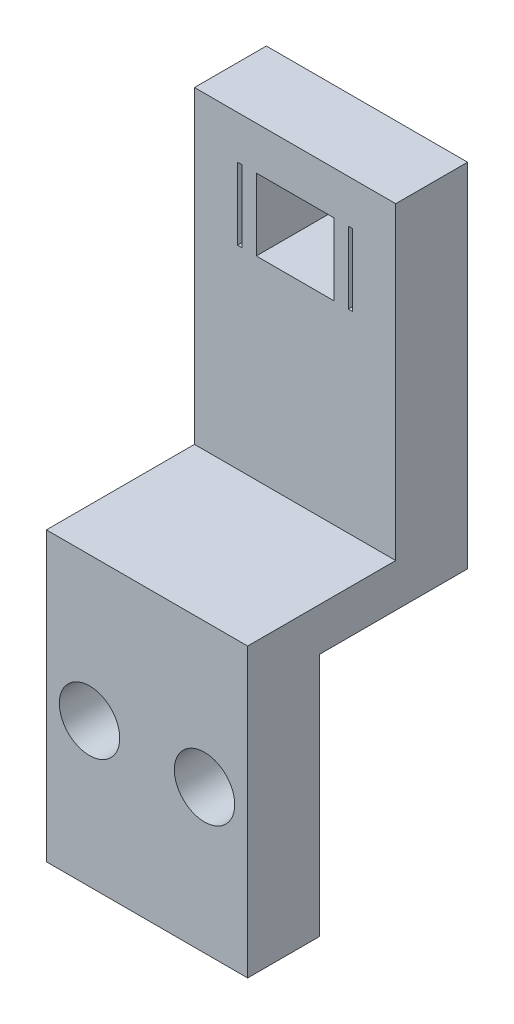
ISO-10303-21;
HEADER;
FILE_DESCRIPTION(('STEP AP214'),'2;1');
FILE_NAME('part.step','',(''),(''),'','','');
FILE_SCHEMA(('AUTOMOTIVE_DESIGN { 1 0 10303 214 1 1 1 1 }'));
ENDSEC;
DATA;
#1=APPLICATION_CONTEXT('core data for automotive mechanical design processes');
#2=APPLICATION_PROTOCOL_DEFINITION('international standard','automotive_design',2000,#1);
#3=PRODUCT_CONTEXT('',#1,'mechanical');
#4=PRODUCT('Part','Part','',(#3));
#5=PRODUCT_RELATED_PRODUCT_CATEGORY('part','',(#4));
#6=PRODUCT_DEFINITION_FORMATION('','',#4);
#7=PRODUCT_DEFINITION_CONTEXT('part definition',#1,'design');
#8=PRODUCT_DEFINITION('design','',#6,#7);
#9=PRODUCT_DEFINITION_SHAPE('','',#8);
#10=(LENGTH_UNIT() NAMED_UNIT(*) SI_UNIT(.MILLI.,.METRE.));
#11=(NAMED_UNIT(*) PLANE_ANGLE_UNIT() SI_UNIT($,.RADIAN.));
#12=(NAMED_UNIT(*) SI_UNIT($,.STERADIAN.) SOLID_ANGLE_UNIT());
#13=UNCERTAINTY_MEASURE_WITH_UNIT(LENGTH_MEASURE(1.E-05),#10,'distance_accuracy_value','');
#14=(GEOMETRIC_REPRESENTATION_CONTEXT(3) GLOBAL_UNCERTAINTY_ASSIGNED_CONTEXT((#13)) GLOBAL_UNIT_ASSIGNED_CONTEXT((#10,
#11,#12)) REPRESENTATION_CONTEXT('',''));
#15=CARTESIAN_POINT('',(0.,0.,0.));
#16=DIRECTION('',(0.,0.,1.));
#17=DIRECTION('',(1.,0.,0.));
#18=AXIS2_PLACEMENT_3D('',#15,#16,#17);
#19=CARTESIAN_POINT('',(0.,38.5,15.3));
#20=DIRECTION('',(0.,1.,0.));
#21=DIRECTION('',(-1.,0.,0.));
#22=AXIS2_PLACEMENT_3D('',#19,#20,#21);
#23=PLANE('',#22);
#24=DIRECTION('',(0.,0.,-1.));
#25=VECTOR('',#24,1.);
#26=CARTESIAN_POINT('',(3.3,38.5,15.3));
#27=LINE('',#26,#25);
#28=CARTESIAN_POINT('',(3.3,38.5,5.));
#29=VERTEX_POINT('',#28);
#30=CARTESIAN_POINT('',(3.3,38.5,0.));
#31=VERTEX_POINT('',#30);
#32=EDGE_CURVE('E215',#29,#31,#27,.T.);
#33=ORIENTED_EDGE('',*,*,#32,.F.);
#34=DIRECTION('',(-1.,0.,0.));
#35=VECTOR('',#34,1.);
#36=CARTESIAN_POINT('',(0.,38.5,5.));
#37=LINE('',#36,#35);
#38=CARTESIAN_POINT('',(3.,38.5,5.));
#39=VERTEX_POINT('',#38);
#40=EDGE_CURVE('E421',#29,#39,#37,.T.);
#41=ORIENTED_EDGE('',*,*,#40,.T.);
#42=DIRECTION('',(0.,0.,-1.));
#43=VECTOR('',#42,1.);
#44=CARTESIAN_POINT('',(3.,38.5,15.3));
#45=LINE('',#44,#43);
#46=CARTESIAN_POINT('',(3.,38.5,0.));
#47=VERTEX_POINT('',#46);
#48=EDGE_CURVE('E221',#39,#47,#45,.T.);
#49=ORIENTED_EDGE('',*,*,#48,.T.);
#50=DIRECTION('',(1.,0.,0.));
#51=VECTOR('',#50,1.);
#52=CARTESIAN_POINT('',(0.,38.5,0.));
#53=LINE('',#52,#51);
#54=EDGE_CURVE('E273',#47,#31,#53,.T.);
#55=ORIENTED_EDGE('',*,*,#54,.T.);
#56=EDGE_LOOP('',(#33,#41,#49,#55));
#57=FACE_BOUND('',#56,.T.);
#58=ADVANCED_FACE('F43',(#57),#23,.F.);
#59=CARTESIAN_POINT('',(3.3,0.,15.3));
#60=DIRECTION('',(1.,0.,0.));
#61=DIRECTION('',(0.,1.,0.));
#62=AXIS2_PLACEMENT_3D('',#59,#60,#61);
#63=PLANE('',#62);
#64=DIRECTION('',(0.,0.,-1.));
#65=VECTOR('',#64,1.);
#66=CARTESIAN_POINT('',(3.3,33.5,15.3));
#67=LINE('',#66,#65);
#68=CARTESIAN_POINT('',(3.3,33.5,5.));
#69=VERTEX_POINT('',#68);
#70=CARTESIAN_POINT('',(3.3,33.5,0.));
#71=VERTEX_POINT('',#70);
#72=EDGE_CURVE('E306',#69,#71,#67,.T.);
#73=ORIENTED_EDGE('',*,*,#72,.F.);
#74=DIRECTION('',(0.,1.,0.));
#75=VECTOR('',#74,1.);
#76=CARTESIAN_POINT('',(3.3,0.,5.00000000000001));
#77=LINE('',#76,#75);
#78=EDGE_CURVE('E317',#69,#29,#77,.T.);
#79=ORIENTED_EDGE('',*,*,#78,.T.);
#80=ORIENTED_EDGE('',*,*,#32,.T.);
#81=DIRECTION('',(0.,-1.,0.));
#82=VECTOR('',#81,1.);
#83=CARTESIAN_POINT('',(3.3,0.,0.));
#84=LINE('',#83,#82);
#85=EDGE_CURVE('E297',#31,#71,#84,.T.);
#86=ORIENTED_EDGE('',*,*,#85,.T.);
#87=EDGE_LOOP('',(#73,#79,#80,#86));
#88=FACE_BOUND('',#87,.T.);
#89=ADVANCED_FACE('F315',(#88),#63,.F.);
#90=CARTESIAN_POINT('',(0.,33.5,15.3));
#91=DIRECTION('',(0.,1.,0.));
#92=DIRECTION('',(0.,0.,1.));
#93=AXIS2_PLACEMENT_3D('',#90,#91,#92);
#94=PLANE('',#93);
#95=DIRECTION('',(-1.,0.,0.));
#96=VECTOR('',#95,1.);
#97=CARTESIAN_POINT('',(0.,33.5,5.));
#98=LINE('',#97,#96);
#99=CARTESIAN_POINT('',(3.,33.5,5.));
#100=VERTEX_POINT('',#99);
#101=EDGE_CURVE('E255',#69,#100,#98,.T.);
#102=ORIENTED_EDGE('',*,*,#101,.F.);
#103=ORIENTED_EDGE('',*,*,#72,.T.);
#104=DIRECTION('',(1.,0.,0.));
#105=VECTOR('',#104,1.);
#106=CARTESIAN_POINT('',(0.,33.5,0.));
#107=LINE('',#106,#105);
#108=CARTESIAN_POINT('',(3.,33.5,0.));
#109=VERTEX_POINT('',#108);
#110=EDGE_CURVE('E281',#109,#71,#107,.T.);
#111=ORIENTED_EDGE('',*,*,#110,.F.);
#112=DIRECTION('',(0.,0.,-1.));
#113=VECTOR('',#112,1.);
#114=CARTESIAN_POINT('',(3.,33.5,15.3));
#115=LINE('',#114,#113);
#116=EDGE_CURVE('E305',#100,#109,#115,.T.);
#117=ORIENTED_EDGE('',*,*,#116,.F.);
#118=EDGE_LOOP('',(#102,#103,#111,#117));
#119=FACE_BOUND('',#118,.T.);
#120=ADVANCED_FACE('F388',(#119),#94,.T.);
#121=CARTESIAN_POINT('',(0.,0.,15.3));
#122=DIRECTION('',(0.,1.,0.));
#123=DIRECTION('',(0.,0.,1.));
#124=AXIS2_PLACEMENT_3D('',#121,#122,#123);
#125=PLANE('',#124);
#126=DIRECTION('',(0.,0.,-1.));
#127=VECTOR('',#126,1.);
#128=CARTESIAN_POINT('',(0.,0.,15.3));
#129=LINE('',#128,#127);
#130=CARTESIAN_POINT('',(0.,0.,15.3));
#131=VERTEX_POINT('',#130);
#132=CARTESIAN_POINT('',(0.,0.,10.3));
#133=VERTEX_POINT('',#132);
#134=EDGE_CURVE('E198',#131,#133,#129,.T.);
#135=ORIENTED_EDGE('',*,*,#134,.T.);
#136=DIRECTION('',(-1.,0.,0.));
#137=VECTOR('',#136,1.);
#138=CARTESIAN_POINT('',(21.,0.,10.3));
#139=LINE('',#138,#137);
#140=CARTESIAN_POINT('',(14.,0.,10.3));
#141=VERTEX_POINT('',#140);
#142=EDGE_CURVE('E180',#141,#133,#139,.T.);
#143=ORIENTED_EDGE('',*,*,#142,.F.);
#144=DIRECTION('',(0.,0.,-1.));
#145=VECTOR('',#144,1.);
#146=CARTESIAN_POINT('',(14.,0.,15.3));
#147=LINE('',#146,#145);
#148=CARTESIAN_POINT('',(14.,0.,15.3));
#149=VERTEX_POINT('',#148);
#150=EDGE_CURVE('E219',#149,#141,#147,.T.);
#151=ORIENTED_EDGE('',*,*,#150,.F.);
#152=DIRECTION('',(1.,0.,0.));
#153=VECTOR('',#152,1.);
#154=CARTESIAN_POINT('',(0.,0.,15.3));
#155=LINE('',#154,#153);
#156=EDGE_CURVE('E205',#131,#149,#155,.T.);
#157=ORIENTED_EDGE('',*,*,#156,.F.);
#158=EDGE_LOOP('',(#135,#143,#151,#157));
#159=FACE_BOUND('',#158,.T.);
#160=ADVANCED_FACE('F203',(#159),#125,.F.);
#161=CARTESIAN_POINT('',(14.,0.,15.3));
#162=DIRECTION('',(-1.,0.,0.));
#163=DIRECTION('',(0.,-1.,0.));
#164=AXIS2_PLACEMENT_3D('',#161,#162,#163);
#165=PLANE('',#164);
#166=DIRECTION('',(0.,1.,0.));
#167=VECTOR('',#166,1.);
#168=CARTESIAN_POINT('',(14.,0.,10.3));
#169=LINE('',#168,#167);
#170=CARTESIAN_POINT('',(14.,17.,10.3));
#171=VERTEX_POINT('',#170);
#172=EDGE_CURVE('E187',#141,#171,#169,.T.);
#173=ORIENTED_EDGE('',*,*,#172,.T.);
#174=DIRECTION('',(0.,0.,-1.));
#175=VECTOR('',#174,1.);
#176=CARTESIAN_POINT('',(14.,17.,15.3));
#177=LINE('',#176,#175);
#178=CARTESIAN_POINT('',(14.,17.,0.));
#179=VERTEX_POINT('',#178);
#180=EDGE_CURVE('E256',#171,#179,#177,.T.);
#181=ORIENTED_EDGE('',*,*,#180,.T.);
#182=DIRECTION('',(0.,1.,0.));
#183=VECTOR('',#182,1.);
#184=CARTESIAN_POINT('',(14.,0.,0.));
#185=LINE('',#184,#183);
#186=CARTESIAN_POINT('',(14.,41.5,0.));
#187=VERTEX_POINT('',#186);
#188=EDGE_CURVE('E288',#179,#187,#185,.T.);
#189=ORIENTED_EDGE('',*,*,#188,.T.);
#190=DIRECTION('',(0.,0.,-1.));
#191=VECTOR('',#190,1.);
#192=CARTESIAN_POINT('',(14.,41.5,15.3));
#193=LINE('',#192,#191);
#194=CARTESIAN_POINT('',(14.,41.5,5.));
#195=VERTEX_POINT('',#194);
#196=EDGE_CURVE('E210',#195,#187,#193,.T.);
#197=ORIENTED_EDGE('',*,*,#196,.F.);
#198=DIRECTION('',(0.,-1.,0.));
#199=VECTOR('',#198,1.);
#200=CARTESIAN_POINT('',(14.,0.,5.00000000000001));
#201=LINE('',#200,#199);
#202=CARTESIAN_POINT('',(14.,20.,5.));
#203=VERTEX_POINT('',#202);
#204=EDGE_CURVE('E254',#195,#203,#201,.T.);
#205=ORIENTED_EDGE('',*,*,#204,.T.);
#206=DIRECTION('',(0.,0.,1.));
#207=VECTOR('',#206,1.);
#208=CARTESIAN_POINT('',(14.,20.,15.3));
#209=LINE('',#208,#207);
#210=CARTESIAN_POINT('',(14.,20.,15.3));
#211=VERTEX_POINT('',#210);
#212=EDGE_CURVE('E243',#203,#211,#209,.T.);
#213=ORIENTED_EDGE('',*,*,#212,.T.);
#214=DIRECTION('',(0.,1.,0.));
#215=VECTOR('',#214,1.);
#216=CARTESIAN_POINT('',(14.,0.,15.3));
#217=LINE('',#216,#215);
#218=EDGE_CURVE('E252',#149,#211,#217,.T.);
#219=ORIENTED_EDGE('',*,*,#218,.F.);
#220=ORIENTED_EDGE('',*,*,#150,.T.);
#221=EDGE_LOOP('',(#173,#181,#189,#197,#205,#213,#219,#220));
#222=FACE_BOUND('',#221,.T.);
#223=ADVANCED_FACE('F251',(#222),#165,.F.);
#224=CARTESIAN_POINT('',(0.,41.5,15.3));
#225=DIRECTION('',(0.,1.,0.));
#226=DIRECTION('',(0.,0.,1.));
#227=AXIS2_PLACEMENT_3D('',#224,#225,#226);
#228=PLANE('',#227);
#229=DIRECTION('',(-1.,0.,0.));
#230=VECTOR('',#229,1.);
#231=CARTESIAN_POINT('',(21.,41.5,5.));
#232=LINE('',#231,#230);
#233=CARTESIAN_POINT('',(0.,41.5,5.));
#234=VERTEX_POINT('',#233);
#235=EDGE_CURVE('E567',#195,#234,#232,.T.);
#236=ORIENTED_EDGE('',*,*,#235,.F.);
#237=ORIENTED_EDGE('',*,*,#196,.T.);
#238=DIRECTION('',(1.,0.,0.));
#239=VECTOR('',#238,1.);
#240=CARTESIAN_POINT('',(0.,41.5,0.));
#241=LINE('',#240,#239);
#242=CARTESIAN_POINT('',(0.,41.5,0.));
#243=VERTEX_POINT('',#242);
#244=EDGE_CURVE('E291',#243,#187,#241,.T.);
#245=ORIENTED_EDGE('',*,*,#244,.F.);
#246=DIRECTION('',(0.,0.,-1.));
#247=VECTOR('',#246,1.);
#248=CARTESIAN_POINT('',(0.,41.5,15.3));
#249=LINE('',#248,#247);
#250=EDGE_CURVE('E207',#234,#243,#249,.T.);
#251=ORIENTED_EDGE('',*,*,#250,.F.);
#252=EDGE_LOOP('',(#236,#237,#245,#251));
#253=FACE_BOUND('',#252,.T.);
#254=ADVANCED_FACE('F400',(#253),#228,.T.);
#255=CARTESIAN_POINT('',(10.7,0.,15.3));
#256=DIRECTION('',(1.,0.,0.));
#257=DIRECTION('',(0.,1.,0.));
#258=AXIS2_PLACEMENT_3D('',#255,#256,#257);
#259=PLANE('',#258);
#260=DIRECTION('',(0.,1.,0.));
#261=VECTOR('',#260,1.);
#262=CARTESIAN_POINT('',(10.7,0.,5.00000000000001));
#263=LINE('',#262,#261);
#264=CARTESIAN_POINT('',(10.7,33.5,5.));
#265=VERTEX_POINT('',#264);
#266=CARTESIAN_POINT('',(10.7,38.5,5.));
#267=VERTEX_POINT('',#266);
#268=EDGE_CURVE('E343',#265,#267,#263,.T.);
#269=ORIENTED_EDGE('',*,*,#268,.F.);
#270=DIRECTION('',(0.,0.,-1.));
#271=VECTOR('',#270,1.);
#272=CARTESIAN_POINT('',(10.7,33.5,15.3));
#273=LINE('',#272,#271);
#274=CARTESIAN_POINT('',(10.7,33.5,0.));
#275=VERTEX_POINT('',#274);
#276=EDGE_CURVE('E222',#265,#275,#273,.T.);
#277=ORIENTED_EDGE('',*,*,#276,.T.);
#278=DIRECTION('',(0.,-1.,0.));
#279=VECTOR('',#278,1.);
#280=CARTESIAN_POINT('',(10.7,0.,0.));
#281=LINE('',#280,#279);
#282=CARTESIAN_POINT('',(10.7,38.5,0.));
#283=VERTEX_POINT('',#282);
#284=EDGE_CURVE('E280',#283,#275,#281,.T.);
#285=ORIENTED_EDGE('',*,*,#284,.F.);
#286=DIRECTION('',(0.,0.,-1.));
#287=VECTOR('',#286,1.);
#288=CARTESIAN_POINT('',(10.7,38.5,15.3));
#289=LINE('',#288,#287);
#290=EDGE_CURVE('E208',#267,#283,#289,.T.);
#291=ORIENTED_EDGE('',*,*,#290,.F.);
#292=EDGE_LOOP('',(#269,#277,#285,#291));
#293=FACE_BOUND('',#292,.T.);
#294=ADVANCED_FACE('F341',(#293),#259,.T.);
#295=DIRECTION('',(0.,0.,-1.));
#296=VECTOR('',#295,1.);
#297=CARTESIAN_POINT('',(11.,38.5,15.3));
#298=LINE('',#297,#296);
#299=CARTESIAN_POINT('',(11.,38.5,5.));
#300=VERTEX_POINT('',#299);
#301=CARTESIAN_POINT('',(11.,38.5,0.));
#302=VERTEX_POINT('',#301);
#303=EDGE_CURVE('E212',#300,#302,#298,.T.);
#304=ORIENTED_EDGE('',*,*,#303,.F.);
#305=DIRECTION('',(-1.,0.,0.));
#306=VECTOR('',#305,1.);
#307=CARTESIAN_POINT('',(0.,38.5,5.));
#308=LINE('',#307,#306);
#309=EDGE_CURVE('E350',#300,#267,#308,.T.);
#310=ORIENTED_EDGE('',*,*,#309,.T.);
#311=ORIENTED_EDGE('',*,*,#290,.T.);
#312=EDGE_CURVE('E274',#283,#302,#53,.T.);
#313=ORIENTED_EDGE('',*,*,#312,.T.);
#314=EDGE_LOOP('',(#304,#310,#311,#313));
#315=FACE_BOUND('',#314,.T.);
#316=ADVANCED_FACE('F330',(#315),#23,.F.);
#317=CARTESIAN_POINT('',(11.,0.,15.3));
#318=DIRECTION('',(1.,0.,0.));
#319=DIRECTION('',(0.,0.,-1.));
#320=AXIS2_PLACEMENT_3D('',#317,#318,#319);
#321=PLANE('',#320);
#322=DIRECTION('',(0.,0.,-1.));
#323=VECTOR('',#322,1.);
#324=CARTESIAN_POINT('',(11.,33.5,15.3));
#325=LINE('',#324,#323);
#326=CARTESIAN_POINT('',(11.,33.5,5.));
#327=VERTEX_POINT('',#326);
#328=CARTESIAN_POINT('',(11.,33.5,0.));
#329=VERTEX_POINT('',#328);
#330=EDGE_CURVE('E224',#327,#329,#325,.T.);
#331=ORIENTED_EDGE('',*,*,#330,.F.);
#332=DIRECTION('',(0.,1.,0.));
#333=VECTOR('',#332,1.);
#334=CARTESIAN_POINT('',(11.,0.,5.00000000000001));
#335=LINE('',#334,#333);
#336=EDGE_CURVE('E59',#327,#300,#335,.T.);
#337=ORIENTED_EDGE('',*,*,#336,.T.);
#338=ORIENTED_EDGE('',*,*,#303,.T.);
#339=DIRECTION('',(0.,-1.,0.));
#340=VECTOR('',#339,1.);
#341=CARTESIAN_POINT('',(11.,0.,0.));
#342=LINE('',#341,#340);
#343=EDGE_CURVE('E285',#302,#329,#342,.T.);
#344=ORIENTED_EDGE('',*,*,#343,.T.);
#345=EDGE_LOOP('',(#331,#337,#338,#344));
#346=FACE_BOUND('',#345,.T.);
#347=ADVANCED_FACE('F349',(#346),#321,.F.);
#348=CARTESIAN_POINT('',(4.30000000000001,0.,15.3));
#349=DIRECTION('',(1.,0.,0.));
#350=DIRECTION('',(0.,1.,0.));
#351=AXIS2_PLACEMENT_3D('',#348,#349,#350);
#352=PLANE('',#351);
#353=DIRECTION('',(0.,1.,0.));
#354=VECTOR('',#353,1.);
#355=CARTESIAN_POINT('',(4.30000000000001,0.,5.00000000000001));
#356=LINE('',#355,#354);
#357=CARTESIAN_POINT('',(4.3,33.5,5.));
#358=VERTEX_POINT('',#357);
#359=CARTESIAN_POINT('',(4.3,38.5,5.));
#360=VERTEX_POINT('',#359);
#361=EDGE_CURVE('E353',#358,#360,#356,.T.);
#362=ORIENTED_EDGE('',*,*,#361,.F.);
#363=DIRECTION('',(0.,0.,-1.));
#364=VECTOR('',#363,1.);
#365=CARTESIAN_POINT('',(4.3,33.5,15.3));
#366=LINE('',#365,#364);
#367=CARTESIAN_POINT('',(4.3,33.5,0.));
#368=VERTEX_POINT('',#367);
#369=EDGE_CURVE('E228',#358,#368,#366,.T.);
#370=ORIENTED_EDGE('',*,*,#369,.T.);
#371=DIRECTION('',(0.,-1.,0.));
#372=VECTOR('',#371,1.);
#373=CARTESIAN_POINT('',(4.30000000000001,0.,0.));
#374=LINE('',#373,#372);
#375=CARTESIAN_POINT('',(4.3,38.5,0.));
#376=VERTEX_POINT('',#375);
#377=EDGE_CURVE('E266',#376,#368,#374,.T.);
#378=ORIENTED_EDGE('',*,*,#377,.F.);
#379=DIRECTION('',(0.,0.,-1.));
#380=VECTOR('',#379,1.);
#381=CARTESIAN_POINT('',(4.3,38.5,15.3));
#382=LINE('',#381,#380);
#383=EDGE_CURVE('E225',#360,#376,#382,.T.);
#384=ORIENTED_EDGE('',*,*,#383,.F.);
#385=EDGE_LOOP('',(#362,#370,#378,#384));
#386=FACE_BOUND('',#385,.T.);
#387=ADVANCED_FACE('F45',(#386),#352,.T.);
#388=DIRECTION('',(0.,0.,-1.));
#389=VECTOR('',#388,1.);
#390=CARTESIAN_POINT('',(9.7,38.5,15.3));
#391=LINE('',#390,#389);
#392=CARTESIAN_POINT('',(9.7,38.5,5.));
#393=VERTEX_POINT('',#392);
#394=CARTESIAN_POINT('',(9.7,38.5,0.));
#395=VERTEX_POINT('',#394);
#396=EDGE_CURVE('E233',#393,#395,#391,.T.);
#397=ORIENTED_EDGE('',*,*,#396,.F.);
#398=DIRECTION('',(-1.,0.,0.));
#399=VECTOR('',#398,1.);
#400=CARTESIAN_POINT('',(0.,38.5,5.));
#401=LINE('',#400,#399);
#402=EDGE_CURVE('E423',#393,#360,#401,.T.);
#403=ORIENTED_EDGE('',*,*,#402,.T.);
#404=ORIENTED_EDGE('',*,*,#383,.T.);
#405=EDGE_CURVE('E269',#376,#395,#53,.T.);
#406=ORIENTED_EDGE('',*,*,#405,.T.);
#407=EDGE_LOOP('',(#397,#403,#404,#406));
#408=FACE_BOUND('',#407,.T.);
#409=ADVANCED_FACE('F384',(#408),#23,.F.);
#410=CARTESIAN_POINT('',(9.7,0.,15.3));
#411=DIRECTION('',(1.,0.,0.));
#412=DIRECTION('',(0.,0.,-1.));
#413=AXIS2_PLACEMENT_3D('',#410,#411,#412);
#414=PLANE('',#413);
#415=DIRECTION('',(0.,0.,-1.));
#416=VECTOR('',#415,1.);
#417=CARTESIAN_POINT('',(9.7,33.5,15.3));
#418=LINE('',#417,#416);
#419=CARTESIAN_POINT('',(9.7,33.5,5.));
#420=VERTEX_POINT('',#419);
#421=CARTESIAN_POINT('',(9.7,33.5,0.));
#422=VERTEX_POINT('',#421);
#423=EDGE_CURVE('E230',#420,#422,#418,.T.);
#424=ORIENTED_EDGE('',*,*,#423,.F.);
#425=DIRECTION('',(0.,1.,0.));
#426=VECTOR('',#425,1.);
#427=CARTESIAN_POINT('',(9.7,0.,5.00000000000001));
#428=LINE('',#427,#426);
#429=EDGE_CURVE('E67',#420,#393,#428,.T.);
#430=ORIENTED_EDGE('',*,*,#429,.T.);
#431=ORIENTED_EDGE('',*,*,#396,.T.);
#432=DIRECTION('',(0.,-1.,0.));
#433=VECTOR('',#432,1.);
#434=CARTESIAN_POINT('',(9.7,0.,0.));
#435=LINE('',#434,#433);
#436=EDGE_CURVE('E272',#395,#422,#435,.T.);
#437=ORIENTED_EDGE('',*,*,#436,.T.);
#438=EDGE_LOOP('',(#424,#430,#431,#437));
#439=FACE_BOUND('',#438,.T.);
#440=ADVANCED_FACE('F392',(#439),#414,.F.);
#441=CARTESIAN_POINT('',(0.,0.,15.3));
#442=DIRECTION('',(-1.,0.,0.));
#443=DIRECTION('',(0.,-1.,0.));
#444=AXIS2_PLACEMENT_3D('',#441,#442,#443);
#445=PLANE('',#444);
#446=DIRECTION('',(0.,0.,-1.));
#447=VECTOR('',#446,1.);
#448=CARTESIAN_POINT('',(0.,17.,0.));
#449=LINE('',#448,#447);
#450=CARTESIAN_POINT('',(0.,17.,10.3));
#451=VERTEX_POINT('',#450);
#452=CARTESIAN_POINT('',(0.,17.,0.));
#453=VERTEX_POINT('',#452);
#454=EDGE_CURVE('E193',#451,#453,#449,.T.);
#455=ORIENTED_EDGE('',*,*,#454,.F.);
#456=DIRECTION('',(0.,1.,0.));
#457=VECTOR('',#456,1.);
#458=CARTESIAN_POINT('',(0.,0.,10.3));
#459=LINE('',#458,#457);
#460=EDGE_CURVE('E184',#133,#451,#459,.T.);
#461=ORIENTED_EDGE('',*,*,#460,.F.);
#462=ORIENTED_EDGE('',*,*,#134,.F.);
#463=DIRECTION('',(0.,1.,0.));
#464=VECTOR('',#463,1.);
#465=CARTESIAN_POINT('',(0.,0.,15.3));
#466=LINE('',#465,#464);
#467=CARTESIAN_POINT('',(0.,20.,15.3));
#468=VERTEX_POINT('',#467);
#469=EDGE_CURVE('E231',#131,#468,#466,.T.);
#470=ORIENTED_EDGE('',*,*,#469,.T.);
#471=DIRECTION('',(0.,0.,1.));
#472=VECTOR('',#471,1.);
#473=CARTESIAN_POINT('',(0.,20.,15.3));
#474=LINE('',#473,#472);
#475=CARTESIAN_POINT('',(0.,20.,5.));
#476=VERTEX_POINT('',#475);
#477=EDGE_CURVE('E246',#476,#468,#474,.T.);
#478=ORIENTED_EDGE('',*,*,#477,.F.);
#479=DIRECTION('',(0.,-1.,0.));
#480=VECTOR('',#479,1.);
#481=CARTESIAN_POINT('',(0.,41.5,5.));
#482=LINE('',#481,#480);
#483=EDGE_CURVE('E201',#234,#476,#482,.T.);
#484=ORIENTED_EDGE('',*,*,#483,.F.);
#485=ORIENTED_EDGE('',*,*,#250,.T.);
#486=DIRECTION('',(0.,1.,0.));
#487=VECTOR('',#486,1.);
#488=CARTESIAN_POINT('',(0.,0.,0.));
#489=LINE('',#488,#487);
#490=EDGE_CURVE('E294',#453,#243,#489,.T.);
#491=ORIENTED_EDGE('',*,*,#490,.F.);
#492=EDGE_LOOP('',(#455,#461,#462,#470,#478,#484,#485,#491));
#493=FACE_BOUND('',#492,.T.);
#494=ADVANCED_FACE('F196',(#493),#445,.T.);
#495=CARTESIAN_POINT('',(3.,10.,15.3));
#496=DIRECTION('',(0.,0.,-1.));
#497=DIRECTION('',(-1.,0.,0.));
#498=AXIS2_PLACEMENT_3D('',#495,#496,#497);
#499=CYLINDRICAL_SURFACE('',#498,2.1);
#500=CARTESIAN_POINT('',(3.,10.,10.3));
#501=DIRECTION('',(0.,0.,1.));
#502=DIRECTION('',(1.,0.,0.));
#503=AXIS2_PLACEMENT_3D('',#500,#501,#502);
#504=CIRCLE('',#503,2.1);
#505=CARTESIAN_POINT('',(5.1,10.,10.3));
#506=VERTEX_POINT('',#505);
#507=EDGE_CURVE('E359',#506,#506,#504,.T.);
#508=ORIENTED_EDGE('',*,*,#507,.F.);
#509=EDGE_LOOP('',(#508));
#510=FACE_BOUND('',#509,.T.);
#511=CARTESIAN_POINT('',(3.,10.,15.3));
#512=DIRECTION('',(0.,0.,1.));
#513=DIRECTION('',(1.,0.,0.));
#514=AXIS2_PLACEMENT_3D('',#511,#512,#513);
#515=CIRCLE('',#514,2.1);
#516=CARTESIAN_POINT('',(5.1,10.,15.3));
#517=VERTEX_POINT('',#516);
#518=EDGE_CURVE('E262',#517,#517,#515,.T.);
#519=ORIENTED_EDGE('',*,*,#518,.T.);
#520=EDGE_LOOP('',(#519));
#521=FACE_BOUND('',#520,.T.);
#522=ADVANCED_FACE('F367',(#510,#521),#499,.F.);
#523=CARTESIAN_POINT('',(11.,10.,15.3));
#524=DIRECTION('',(0.,0.,-1.));
#525=DIRECTION('',(-1.,0.,0.));
#526=AXIS2_PLACEMENT_3D('',#523,#524,#525);
#527=CYLINDRICAL_SURFACE('',#526,2.1);
#528=CARTESIAN_POINT('',(11.,10.,10.3));
#529=DIRECTION('',(0.,0.,1.));
#530=DIRECTION('',(1.,0.,0.));
#531=AXIS2_PLACEMENT_3D('',#528,#529,#530);
#532=CIRCLE('',#531,2.1);
#533=CARTESIAN_POINT('',(13.1,10.,10.3));
#534=VERTEX_POINT('',#533);
#535=EDGE_CURVE('E47',#534,#534,#532,.T.);
#536=ORIENTED_EDGE('',*,*,#535,.F.);
#537=EDGE_LOOP('',(#536));
#538=FACE_BOUND('',#537,.T.);
#539=CARTESIAN_POINT('',(11.,10.,15.3));
#540=DIRECTION('',(0.,0.,1.));
#541=DIRECTION('',(1.,0.,0.));
#542=AXIS2_PLACEMENT_3D('',#539,#540,#541);
#543=CIRCLE('',#542,2.1);
#544=CARTESIAN_POINT('',(13.1,10.,15.3));
#545=VERTEX_POINT('',#544);
#546=EDGE_CURVE('E303',#545,#545,#543,.T.);
#547=ORIENTED_EDGE('',*,*,#546,.T.);
#548=EDGE_LOOP('',(#547));
#549=FACE_BOUND('',#548,.T.);
#550=ADVANCED_FACE('F467',(#538,#549),#527,.F.);
#551=DIRECTION('',(-1.,0.,0.));
#552=VECTOR('',#551,1.);
#553=CARTESIAN_POINT('',(0.,33.5,5.));
#554=LINE('',#553,#552);
#555=EDGE_CURVE('E346',#327,#265,#554,.T.);
#556=ORIENTED_EDGE('',*,*,#555,.F.);
#557=ORIENTED_EDGE('',*,*,#330,.T.);
#558=EDGE_CURVE('E282',#275,#329,#107,.T.);
#559=ORIENTED_EDGE('',*,*,#558,.F.);
#560=ORIENTED_EDGE('',*,*,#276,.F.);
#561=EDGE_LOOP('',(#556,#557,#559,#560));
#562=FACE_BOUND('',#561,.T.);
#563=ADVANCED_FACE('F345',(#562),#94,.T.);
#564=DIRECTION('',(-1.,0.,0.));
#565=VECTOR('',#564,1.);
#566=CARTESIAN_POINT('',(0.,33.5,5.));
#567=LINE('',#566,#565);
#568=EDGE_CURVE('E419',#420,#358,#567,.T.);
#569=ORIENTED_EDGE('',*,*,#568,.F.);
#570=ORIENTED_EDGE('',*,*,#423,.T.);
#571=EDGE_CURVE('E277',#368,#422,#107,.T.);
#572=ORIENTED_EDGE('',*,*,#571,.F.);
#573=ORIENTED_EDGE('',*,*,#369,.F.);
#574=EDGE_LOOP('',(#569,#570,#572,#573));
#575=FACE_BOUND('',#574,.T.);
#576=ADVANCED_FACE('F378',(#575),#94,.T.);
#577=CARTESIAN_POINT('',(3.,0.,15.3));
#578=DIRECTION('',(1.,0.,0.));
#579=DIRECTION('',(0.,1.,0.));
#580=AXIS2_PLACEMENT_3D('',#577,#578,#579);
#581=PLANE('',#580);
#582=DIRECTION('',(0.,1.,0.));
#583=VECTOR('',#582,1.);
#584=CARTESIAN_POINT('',(3.,0.,5.00000000000001));
#585=LINE('',#584,#583);
#586=EDGE_CURVE('E11',#100,#39,#585,.T.);
#587=ORIENTED_EDGE('',*,*,#586,.F.);
#588=ORIENTED_EDGE('',*,*,#116,.T.);
#589=DIRECTION('',(0.,-1.,0.));
#590=VECTOR('',#589,1.);
#591=CARTESIAN_POINT('',(3.,0.,0.));
#592=LINE('',#591,#590);
#593=EDGE_CURVE('E300',#47,#109,#592,.T.);
#594=ORIENTED_EDGE('',*,*,#593,.F.);
#595=ORIENTED_EDGE('',*,*,#48,.F.);
#596=EDGE_LOOP('',(#587,#588,#594,#595));
#597=FACE_BOUND('',#596,.T.);
#598=ADVANCED_FACE('F370',(#597),#581,.T.);
#599=CARTESIAN_POINT('',(0.,0.,15.3));
#600=DIRECTION('',(0.,0.,1.));
#601=DIRECTION('',(1.,0.,0.));
#602=AXIS2_PLACEMENT_3D('',#599,#600,#601);
#603=PLANE('',#602);
#604=DIRECTION('',(1.,0.,0.));
#605=VECTOR('',#604,1.);
#606=CARTESIAN_POINT('',(0.,20.,15.3));
#607=LINE('',#606,#605);
#608=EDGE_CURVE('E52',#468,#211,#607,.T.);
#609=ORIENTED_EDGE('',*,*,#608,.F.);
#610=ORIENTED_EDGE('',*,*,#469,.F.);
#611=ORIENTED_EDGE('',*,*,#156,.T.);
#612=ORIENTED_EDGE('',*,*,#218,.T.);
#613=EDGE_LOOP('',(#609,#610,#611,#612));
#614=FACE_BOUND('',#613,.T.);
#615=ORIENTED_EDGE('',*,*,#546,.F.);
#616=EDGE_LOOP('',(#615));
#617=FACE_BOUND('',#616,.T.);
#618=ORIENTED_EDGE('',*,*,#518,.F.);
#619=EDGE_LOOP('',(#618));
#620=FACE_BOUND('',#619,.T.);
#621=ADVANCED_FACE('F258',(#614,#617,#620),#603,.T.);
#622=CARTESIAN_POINT('',(0.,0.,0.));
#623=DIRECTION('',(0.,0.,1.));
#624=DIRECTION('',(1.,0.,0.));
#625=AXIS2_PLACEMENT_3D('',#622,#623,#624);
#626=PLANE('',#625);
#627=ORIENTED_EDGE('',*,*,#377,.T.);
#628=ORIENTED_EDGE('',*,*,#571,.T.);
#629=ORIENTED_EDGE('',*,*,#436,.F.);
#630=ORIENTED_EDGE('',*,*,#405,.F.);
#631=EDGE_LOOP('',(#627,#628,#629,#630));
#632=FACE_BOUND('',#631,.T.);
#633=ORIENTED_EDGE('',*,*,#284,.T.);
#634=ORIENTED_EDGE('',*,*,#558,.T.);
#635=ORIENTED_EDGE('',*,*,#343,.F.);
#636=ORIENTED_EDGE('',*,*,#312,.F.);
#637=EDGE_LOOP('',(#633,#634,#635,#636));
#638=FACE_BOUND('',#637,.T.);
#639=ORIENTED_EDGE('',*,*,#188,.F.);
#640=DIRECTION('',(-1.,0.,0.));
#641=VECTOR('',#640,1.);
#642=CARTESIAN_POINT('',(0.,17.,0.));
#643=LINE('',#642,#641);
#644=EDGE_CURVE('E236',#179,#453,#643,.T.);
#645=ORIENTED_EDGE('',*,*,#644,.T.);
#646=ORIENTED_EDGE('',*,*,#490,.T.);
#647=ORIENTED_EDGE('',*,*,#244,.T.);
#648=EDGE_LOOP('',(#639,#645,#646,#647));
#649=FACE_BOUND('',#648,.T.);
#650=ORIENTED_EDGE('',*,*,#54,.F.);
#651=ORIENTED_EDGE('',*,*,#593,.T.);
#652=ORIENTED_EDGE('',*,*,#110,.T.);
#653=ORIENTED_EDGE('',*,*,#85,.F.);
#654=EDGE_LOOP('',(#650,#651,#652,#653));
#655=FACE_BOUND('',#654,.T.);
#656=ADVANCED_FACE('F323',(#632,#638,#649,#655),#626,.F.);
#657=CARTESIAN_POINT('',(21.,0.,10.3));
#658=DIRECTION('',(0.,0.,1.));
#659=DIRECTION('',(1.,0.,0.));
#660=AXIS2_PLACEMENT_3D('',#657,#658,#659);
#661=PLANE('',#660);
#662=ORIENTED_EDGE('',*,*,#507,.T.);
#663=EDGE_LOOP('',(#662));
#664=FACE_BOUND('',#663,.T.);
#665=ORIENTED_EDGE('',*,*,#535,.T.);
#666=EDGE_LOOP('',(#665));
#667=FACE_BOUND('',#666,.T.);
#668=ORIENTED_EDGE('',*,*,#142,.T.);
#669=ORIENTED_EDGE('',*,*,#460,.T.);
#670=DIRECTION('',(-1.,0.,0.));
#671=VECTOR('',#670,1.);
#672=CARTESIAN_POINT('',(21.,17.,10.3));
#673=LINE('',#672,#671);
#674=EDGE_CURVE('E192',#171,#451,#673,.T.);
#675=ORIENTED_EDGE('',*,*,#674,.F.);
#676=ORIENTED_EDGE('',*,*,#172,.F.);
#677=EDGE_LOOP('',(#668,#669,#675,#676));
#678=FACE_BOUND('',#677,.T.);
#679=ADVANCED_FACE('F182',(#664,#667,#678),#661,.F.);
#680=CARTESIAN_POINT('',(21.,17.,0.));
#681=DIRECTION('',(0.,1.,0.));
#682=DIRECTION('',(-1.,0.,0.));
#683=AXIS2_PLACEMENT_3D('',#680,#681,#682);
#684=PLANE('',#683);
#685=ORIENTED_EDGE('',*,*,#674,.T.);
#686=ORIENTED_EDGE('',*,*,#454,.T.);
#687=ORIENTED_EDGE('',*,*,#644,.F.);
#688=ORIENTED_EDGE('',*,*,#180,.F.);
#689=EDGE_LOOP('',(#685,#686,#687,#688));
#690=FACE_BOUND('',#689,.T.);
#691=ADVANCED_FACE('F534',(#690),#684,.F.);
#692=CARTESIAN_POINT('',(21.,41.5,5.));
#693=DIRECTION('',(0.,0.,-1.));
#694=DIRECTION('',(0.,1.,0.));
#695=AXIS2_PLACEMENT_3D('',#692,#693,#694);
#696=PLANE('',#695);
#697=ORIENTED_EDGE('',*,*,#268,.T.);
#698=ORIENTED_EDGE('',*,*,#309,.F.);
#699=ORIENTED_EDGE('',*,*,#336,.F.);
#700=ORIENTED_EDGE('',*,*,#555,.T.);
#701=EDGE_LOOP('',(#697,#698,#699,#700));
#702=FACE_BOUND('',#701,.T.);
#703=ORIENTED_EDGE('',*,*,#361,.T.);
#704=ORIENTED_EDGE('',*,*,#402,.F.);
#705=ORIENTED_EDGE('',*,*,#429,.F.);
#706=ORIENTED_EDGE('',*,*,#568,.T.);
#707=EDGE_LOOP('',(#703,#704,#705,#706));
#708=FACE_BOUND('',#707,.T.);
#709=ORIENTED_EDGE('',*,*,#78,.F.);
#710=ORIENTED_EDGE('',*,*,#101,.T.);
#711=ORIENTED_EDGE('',*,*,#586,.T.);
#712=ORIENTED_EDGE('',*,*,#40,.F.);
#713=EDGE_LOOP('',(#709,#710,#711,#712));
#714=FACE_BOUND('',#713,.T.);
#715=ORIENTED_EDGE('',*,*,#235,.T.);
#716=ORIENTED_EDGE('',*,*,#483,.T.);
#717=DIRECTION('',(-1.,0.,0.));
#718=VECTOR('',#717,1.);
#719=CARTESIAN_POINT('',(21.,20.,5.));
#720=LINE('',#719,#718);
#721=EDGE_CURVE('E569',#203,#476,#720,.T.);
#722=ORIENTED_EDGE('',*,*,#721,.F.);
#723=ORIENTED_EDGE('',*,*,#204,.F.);
#724=EDGE_LOOP('',(#715,#716,#722,#723));
#725=FACE_BOUND('',#724,.T.);
#726=ADVANCED_FACE('F429',(#702,#708,#714,#725),#696,.F.);
#727=CARTESIAN_POINT('',(21.,20.,15.3));
#728=DIRECTION('',(0.,-1.,0.));
#729=DIRECTION('',(1.,0.,0.));
#730=AXIS2_PLACEMENT_3D('',#727,#728,#729);
#731=PLANE('',#730);
#732=ORIENTED_EDGE('',*,*,#721,.T.);
#733=ORIENTED_EDGE('',*,*,#477,.T.);
#734=ORIENTED_EDGE('',*,*,#608,.T.);
#735=ORIENTED_EDGE('',*,*,#212,.F.);
#736=EDGE_LOOP('',(#732,#733,#734,#735));
#737=FACE_BOUND('',#736,.T.);
#738=ADVANCED_FACE('F242',(#737),#731,.F.);
#739=CLOSED_SHELL('',(#58,#89,#120,#160,#223,#254,#294,#316,#347,#387,#409,#440,#494,#522,#550,
#563,#576,#598,#621,#656,#679,#691,#726,#738));
#740=MANIFOLD_SOLID_BREP('B2',#739);
#741=ADVANCED_BREP_SHAPE_REPRESENTATION('',(#18,#740),#14);
#742=SHAPE_DEFINITION_REPRESENTATION(#9,#741);
ENDSEC;
END-ISO-10303-21;
